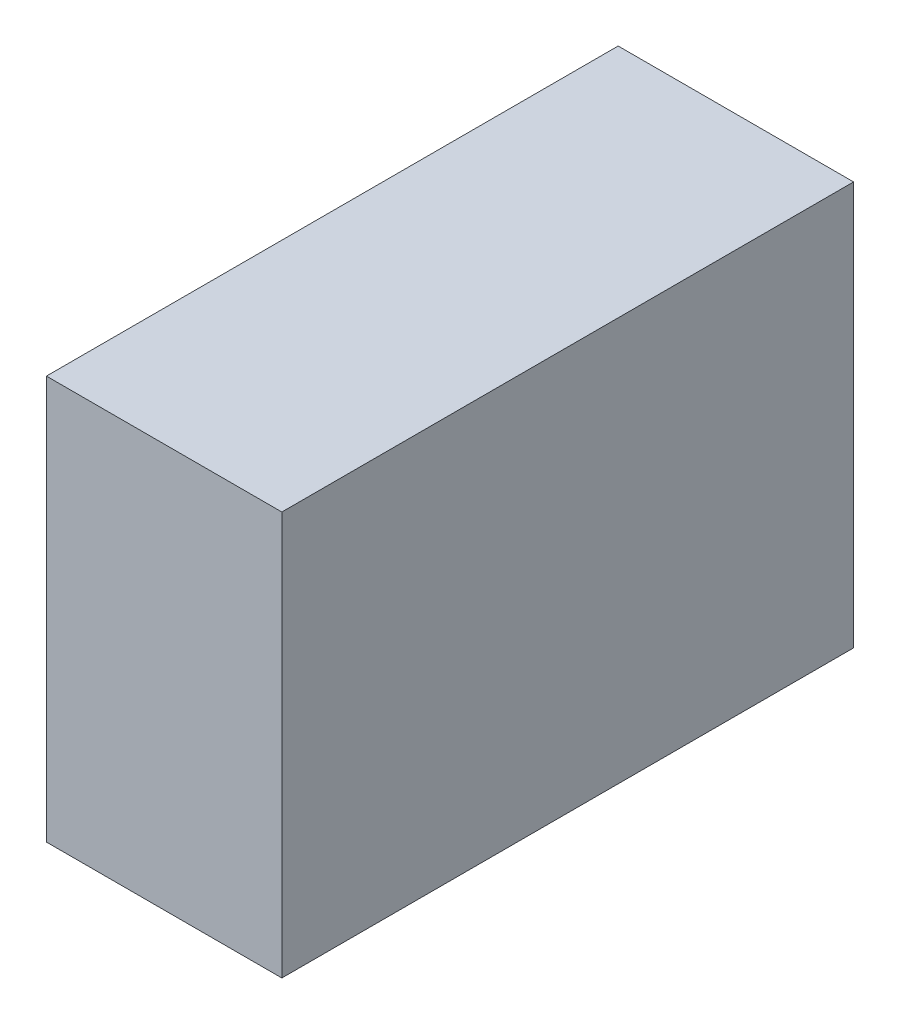
ISO-10303-21;
HEADER;
FILE_DESCRIPTION(('STEP AP214'),'2;1');
FILE_NAME('part.step','',(''),(''),'','','');
FILE_SCHEMA(('AUTOMOTIVE_DESIGN { 1 0 10303 214 1 1 1 1 }'));
ENDSEC;
DATA;
#1=APPLICATION_CONTEXT('core data for automotive mechanical design processes');
#2=APPLICATION_PROTOCOL_DEFINITION('international standard','automotive_design',2000,#1);
#3=PRODUCT_CONTEXT('',#1,'mechanical');
#4=PRODUCT('Part','Part','',(#3));
#5=PRODUCT_RELATED_PRODUCT_CATEGORY('part','',(#4));
#6=PRODUCT_DEFINITION_FORMATION('','',#4);
#7=PRODUCT_DEFINITION_CONTEXT('part definition',#1,'design');
#8=PRODUCT_DEFINITION('design','',#6,#7);
#9=PRODUCT_DEFINITION_SHAPE('','',#8);
#10=(LENGTH_UNIT() NAMED_UNIT(*) SI_UNIT(.MILLI.,.METRE.));
#11=(NAMED_UNIT(*) PLANE_ANGLE_UNIT() SI_UNIT($,.RADIAN.));
#12=(NAMED_UNIT(*) SI_UNIT($,.STERADIAN.) SOLID_ANGLE_UNIT());
#13=UNCERTAINTY_MEASURE_WITH_UNIT(LENGTH_MEASURE(1.E-05),#10,'distance_accuracy_value','');
#14=(GEOMETRIC_REPRESENTATION_CONTEXT(3) GLOBAL_UNCERTAINTY_ASSIGNED_CONTEXT((#13)) GLOBAL_UNIT_ASSIGNED_CONTEXT((#10,
#11,#12)) REPRESENTATION_CONTEXT('',''));
#15=CARTESIAN_POINT('',(0.,0.,0.));
#16=DIRECTION('',(0.,0.,1.));
#17=DIRECTION('',(1.,0.,0.));
#18=AXIS2_PLACEMENT_3D('',#15,#16,#17);
#19=CARTESIAN_POINT('',(-88.8999999999999,-152.4,431.8));
#20=DIRECTION('',(1.,0.,0.));
#21=DIRECTION('',(0.,0.,-1.));
#22=AXIS2_PLACEMENT_3D('',#19,#20,#21);
#23=PLANE('',#22);
#24=DIRECTION('',(0.,-1.,0.));
#25=VECTOR('',#24,1.);
#26=CARTESIAN_POINT('',(-88.8999999999999,-152.4,0.));
#27=LINE('',#26,#25);
#28=CARTESIAN_POINT('',(-88.8999999999999,152.4,0.));
#29=VERTEX_POINT('',#28);
#30=CARTESIAN_POINT('',(-88.8999999999999,-152.4,0.));
#31=VERTEX_POINT('',#30);
#32=EDGE_CURVE('E113',#29,#31,#27,.T.);
#33=ORIENTED_EDGE('',*,*,#32,.T.);
#34=DIRECTION('',(0.,0.,-1.));
#35=VECTOR('',#34,1.);
#36=CARTESIAN_POINT('',(-88.8999999999999,-152.4,431.8));
#37=LINE('',#36,#35);
#38=CARTESIAN_POINT('',(-88.8999999999999,-152.4,431.8));
#39=VERTEX_POINT('',#38);
#40=EDGE_CURVE('E11',#39,#31,#37,.T.);
#41=ORIENTED_EDGE('',*,*,#40,.F.);
#42=DIRECTION('',(0.,-1.,0.));
#43=VECTOR('',#42,1.);
#44=CARTESIAN_POINT('',(-88.8999999999999,-152.4,431.8));
#45=LINE('',#44,#43);
#46=CARTESIAN_POINT('',(-88.8999999999999,152.4,431.8));
#47=VERTEX_POINT('',#46);
#48=EDGE_CURVE('E97',#47,#39,#45,.T.);
#49=ORIENTED_EDGE('',*,*,#48,.F.);
#50=DIRECTION('',(0.,0.,-1.));
#51=VECTOR('',#50,1.);
#52=CARTESIAN_POINT('',(-88.8999999999999,152.4,431.8));
#53=LINE('',#52,#51);
#54=EDGE_CURVE('E109',#47,#29,#53,.T.);
#55=ORIENTED_EDGE('',*,*,#54,.T.);
#56=EDGE_LOOP('',(#33,#41,#49,#55));
#57=FACE_BOUND('',#56,.T.);
#58=ADVANCED_FACE('F45',(#57),#23,.F.);
#59=CARTESIAN_POINT('',(88.9,-152.4,431.8));
#60=DIRECTION('',(0.,1.,0.));
#61=DIRECTION('',(-1.,0.,0.));
#62=AXIS2_PLACEMENT_3D('',#59,#60,#61);
#63=PLANE('',#62);
#64=DIRECTION('',(1.,0.,0.));
#65=VECTOR('',#64,1.);
#66=CARTESIAN_POINT('',(88.9,-152.4,0.));
#67=LINE('',#66,#65);
#68=CARTESIAN_POINT('',(88.9,-152.4,0.));
#69=VERTEX_POINT('',#68);
#70=EDGE_CURVE('E102',#31,#69,#67,.T.);
#71=ORIENTED_EDGE('',*,*,#70,.T.);
#72=DIRECTION('',(0.,0.,-1.));
#73=VECTOR('',#72,1.);
#74=CARTESIAN_POINT('',(88.9,-152.4,431.8));
#75=LINE('',#74,#73);
#76=CARTESIAN_POINT('',(88.9,-152.4,431.8));
#77=VERTEX_POINT('',#76);
#78=EDGE_CURVE('E54',#77,#69,#75,.T.);
#79=ORIENTED_EDGE('',*,*,#78,.F.);
#80=DIRECTION('',(1.,0.,0.));
#81=VECTOR('',#80,1.);
#82=CARTESIAN_POINT('',(88.9,-152.4,431.8));
#83=LINE('',#82,#81);
#84=EDGE_CURVE('E92',#39,#77,#83,.T.);
#85=ORIENTED_EDGE('',*,*,#84,.F.);
#86=ORIENTED_EDGE('',*,*,#40,.T.);
#87=EDGE_LOOP('',(#71,#79,#85,#86));
#88=FACE_BOUND('',#87,.T.);
#89=ADVANCED_FACE('F101',(#88),#63,.F.);
#90=CARTESIAN_POINT('',(88.9,-152.4,431.8));
#91=DIRECTION('',(-1.,0.,0.));
#92=DIRECTION('',(0.,0.,1.));
#93=AXIS2_PLACEMENT_3D('',#90,#91,#92);
#94=PLANE('',#93);
#95=DIRECTION('',(0.,1.,0.));
#96=VECTOR('',#95,1.);
#97=CARTESIAN_POINT('',(88.9,-152.4,0.));
#98=LINE('',#97,#96);
#99=CARTESIAN_POINT('',(88.9,152.4,0.));
#100=VERTEX_POINT('',#99);
#101=EDGE_CURVE('E79',#69,#100,#98,.T.);
#102=ORIENTED_EDGE('',*,*,#101,.T.);
#103=DIRECTION('',(0.,0.,-1.));
#104=VECTOR('',#103,1.);
#105=CARTESIAN_POINT('',(88.9,152.4,431.8));
#106=LINE('',#105,#104);
#107=CARTESIAN_POINT('',(88.9,152.4,431.8));
#108=VERTEX_POINT('',#107);
#109=EDGE_CURVE('E104',#108,#100,#106,.T.);
#110=ORIENTED_EDGE('',*,*,#109,.F.);
#111=DIRECTION('',(0.,1.,0.));
#112=VECTOR('',#111,1.);
#113=CARTESIAN_POINT('',(88.9,-152.4,431.8));
#114=LINE('',#113,#112);
#115=EDGE_CURVE('E95',#77,#108,#114,.T.);
#116=ORIENTED_EDGE('',*,*,#115,.F.);
#117=ORIENTED_EDGE('',*,*,#78,.T.);
#118=EDGE_LOOP('',(#102,#110,#116,#117));
#119=FACE_BOUND('',#118,.T.);
#120=ADVANCED_FACE('F105',(#119),#94,.F.);
#121=CARTESIAN_POINT('',(88.9,152.4,431.8));
#122=DIRECTION('',(0.,-1.,0.));
#123=DIRECTION('',(1.,0.,0.));
#124=AXIS2_PLACEMENT_3D('',#121,#122,#123);
#125=PLANE('',#124);
#126=DIRECTION('',(-1.,0.,0.));
#127=VECTOR('',#126,1.);
#128=CARTESIAN_POINT('',(88.9,152.4,0.));
#129=LINE('',#128,#127);
#130=EDGE_CURVE('E85',#100,#29,#129,.T.);
#131=ORIENTED_EDGE('',*,*,#130,.T.);
#132=ORIENTED_EDGE('',*,*,#54,.F.);
#133=DIRECTION('',(-1.,0.,0.));
#134=VECTOR('',#133,1.);
#135=CARTESIAN_POINT('',(88.9,152.4,431.8));
#136=LINE('',#135,#134);
#137=EDGE_CURVE('E62',#108,#47,#136,.T.);
#138=ORIENTED_EDGE('',*,*,#137,.F.);
#139=ORIENTED_EDGE('',*,*,#109,.T.);
#140=EDGE_LOOP('',(#131,#132,#138,#139));
#141=FACE_BOUND('',#140,.T.);
#142=ADVANCED_FACE('F126',(#141),#125,.F.);
#143=CARTESIAN_POINT('',(0.,0.,431.8));
#144=DIRECTION('',(0.,0.,1.));
#145=DIRECTION('',(1.,0.,0.));
#146=AXIS2_PLACEMENT_3D('',#143,#144,#145);
#147=PLANE('',#146);
#148=ORIENTED_EDGE('',*,*,#48,.T.);
#149=ORIENTED_EDGE('',*,*,#84,.T.);
#150=ORIENTED_EDGE('',*,*,#115,.T.);
#151=ORIENTED_EDGE('',*,*,#137,.T.);
#152=EDGE_LOOP('',(#148,#149,#150,#151));
#153=FACE_BOUND('',#152,.T.);
#154=ADVANCED_FACE('F93',(#153),#147,.T.);
#155=CARTESIAN_POINT('',(0.,0.,0.));
#156=DIRECTION('',(0.,0.,1.));
#157=DIRECTION('',(1.,0.,0.));
#158=AXIS2_PLACEMENT_3D('',#155,#156,#157);
#159=PLANE('',#158);
#160=ORIENTED_EDGE('',*,*,#32,.F.);
#161=ORIENTED_EDGE('',*,*,#130,.F.);
#162=ORIENTED_EDGE('',*,*,#101,.F.);
#163=ORIENTED_EDGE('',*,*,#70,.F.);
#164=EDGE_LOOP('',(#160,#161,#162,#163));
#165=FACE_BOUND('',#164,.T.);
#166=ADVANCED_FACE('F129',(#165),#159,.F.);
#167=CLOSED_SHELL('',(#58,#89,#120,#142,#154,#166));
#168=MANIFOLD_SOLID_BREP('B2',#167);
#169=ADVANCED_BREP_SHAPE_REPRESENTATION('',(#18,#168),#14);
#170=SHAPE_DEFINITION_REPRESENTATION(#9,#169);
ENDSEC;
END-ISO-10303-21;
